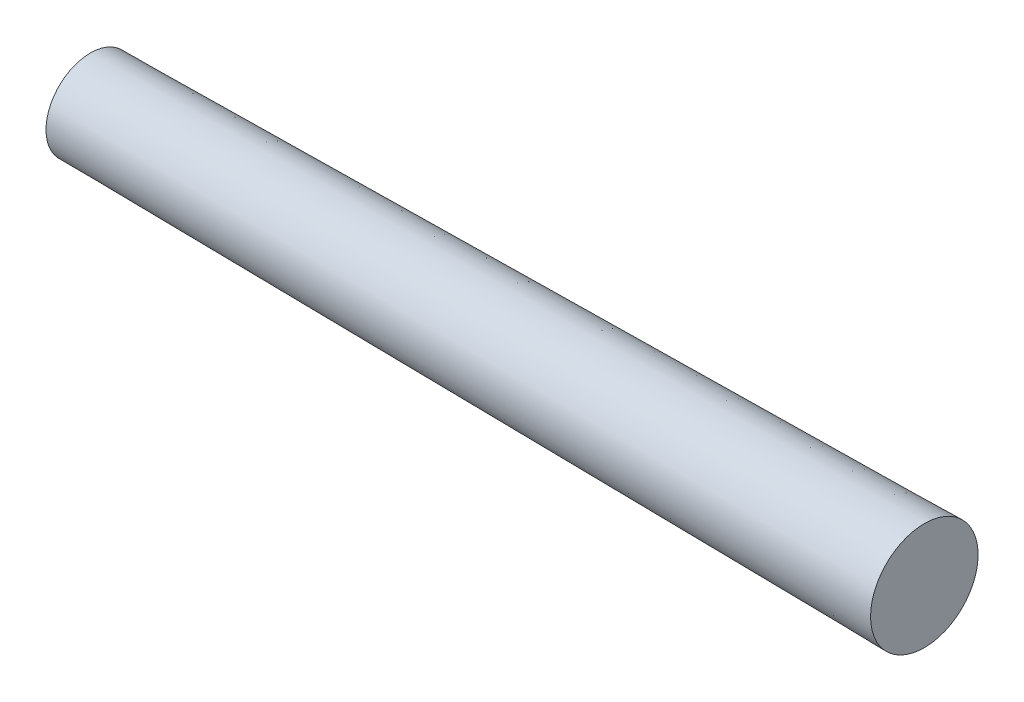
ISO-10303-21;
HEADER;
FILE_DESCRIPTION(('STEP AP214'),'2;1');
FILE_NAME('part.step','',(''),(''),'','','');
FILE_SCHEMA(('AUTOMOTIVE_DESIGN { 1 0 10303 214 1 1 1 1 }'));
ENDSEC;
DATA;
#1=APPLICATION_CONTEXT('core data for automotive mechanical design processes');
#2=APPLICATION_PROTOCOL_DEFINITION('international standard','automotive_design',2000,#1);
#3=PRODUCT_CONTEXT('',#1,'mechanical');
#4=PRODUCT('Part','Part','',(#3));
#5=PRODUCT_RELATED_PRODUCT_CATEGORY('part','',(#4));
#6=PRODUCT_DEFINITION_FORMATION('','',#4);
#7=PRODUCT_DEFINITION_CONTEXT('part definition',#1,'design');
#8=PRODUCT_DEFINITION('design','',#6,#7);
#9=PRODUCT_DEFINITION_SHAPE('','',#8);
#10=(LENGTH_UNIT() NAMED_UNIT(*) SI_UNIT(.MILLI.,.METRE.));
#11=(NAMED_UNIT(*) PLANE_ANGLE_UNIT() SI_UNIT($,.RADIAN.));
#12=(NAMED_UNIT(*) SI_UNIT($,.STERADIAN.) SOLID_ANGLE_UNIT());
#13=UNCERTAINTY_MEASURE_WITH_UNIT(LENGTH_MEASURE(1.E-05),#10,'distance_accuracy_value','');
#14=(GEOMETRIC_REPRESENTATION_CONTEXT(3) GLOBAL_UNCERTAINTY_ASSIGNED_CONTEXT((#13)) GLOBAL_UNIT_ASSIGNED_CONTEXT((#10,
#11,#12)) REPRESENTATION_CONTEXT('',''));
#15=CARTESIAN_POINT('',(0.,0.,0.));
#16=DIRECTION('',(0.,0.,1.));
#17=DIRECTION('',(1.,0.,0.));
#18=AXIS2_PLACEMENT_3D('',#15,#16,#17);
#19=CARTESIAN_POINT('',(-4.63296,0.,0.));
#20=DIRECTION('',(-1.,0.,0.));
#21=DIRECTION('',(0.,1.,0.));
#22=AXIS2_PLACEMENT_3D('',#19,#20,#21);
#23=SPHERICAL_SURFACE('',#22,1.71704);
#24=CARTESIAN_POINT('',(-6.21792,0.,0.));
#25=DIRECTION('',(-1.,0.,0.));
#26=DIRECTION('',(0.,0.,1.));
#27=AXIS2_PLACEMENT_3D('',#24,#25,#26);
#28=CIRCLE('',#27,0.6604);
#29=CARTESIAN_POINT('',(-6.21792,0.,0.6604));
#30=VERTEX_POINT('',#29);
#31=EDGE_CURVE('E10',#30,#30,#28,.T.);
#32=ORIENTED_EDGE('',*,*,#31,.T.);
#33=EDGE_LOOP('',(#32));
#34=FACE_BOUND('',#33,.T.);
#35=ADVANCED_FACE('F30',(#34),#23,.T.);
#36=CARTESIAN_POINT('',(6.18998,0.,0.));
#37=DIRECTION('',(1.,0.,0.));
#38=DIRECTION('',(0.,0.,-1.));
#39=AXIS2_PLACEMENT_3D('',#36,#37,#38);
#40=CONICAL_SURFACE('',#39,0.800100000000001,0.0112584802801288);
#41=ORIENTED_EDGE('',*,*,#31,.F.);
#42=EDGE_LOOP('',(#41));
#43=FACE_BOUND('',#42,.T.);
#44=CARTESIAN_POINT('',(6.18998,0.,0.));
#45=DIRECTION('',(-1.,0.,0.));
#46=DIRECTION('',(0.,0.,1.));
#47=AXIS2_PLACEMENT_3D('',#44,#45,#46);
#48=CIRCLE('',#47,0.800100000000001);
#49=CARTESIAN_POINT('',(6.18998,0.,0.800100000000001));
#50=VERTEX_POINT('',#49);
#51=EDGE_CURVE('E36',#50,#50,#48,.T.);
#52=ORIENTED_EDGE('',*,*,#51,.T.);
#53=EDGE_LOOP('',(#52));
#54=FACE_BOUND('',#53,.T.);
#55=ADVANCED_FACE('F42',(#43,#54),#40,.T.);
#56=CARTESIAN_POINT('',(6.18998000000001,-0.80010000000002,-0.800100000000001));
#57=DIRECTION('',(-1.,0.,0.));
#58=DIRECTION('',(0.,0.,1.));
#59=AXIS2_PLACEMENT_3D('',#56,#57,#58);
#60=PLANE('',#59);
#61=ORIENTED_EDGE('',*,*,#51,.F.);
#62=EDGE_LOOP('',(#61));
#63=FACE_BOUND('',#62,.T.);
#64=ADVANCED_FACE('F44',(#63),#60,.F.);
#65=CLOSED_SHELL('',(#35,#55,#64));
#66=MANIFOLD_SOLID_BREP('B2',#65);
#67=ADVANCED_BREP_SHAPE_REPRESENTATION('',(#18,#66),#14);
#68=SHAPE_DEFINITION_REPRESENTATION(#9,#67);
ENDSEC;
END-ISO-10303-21;
